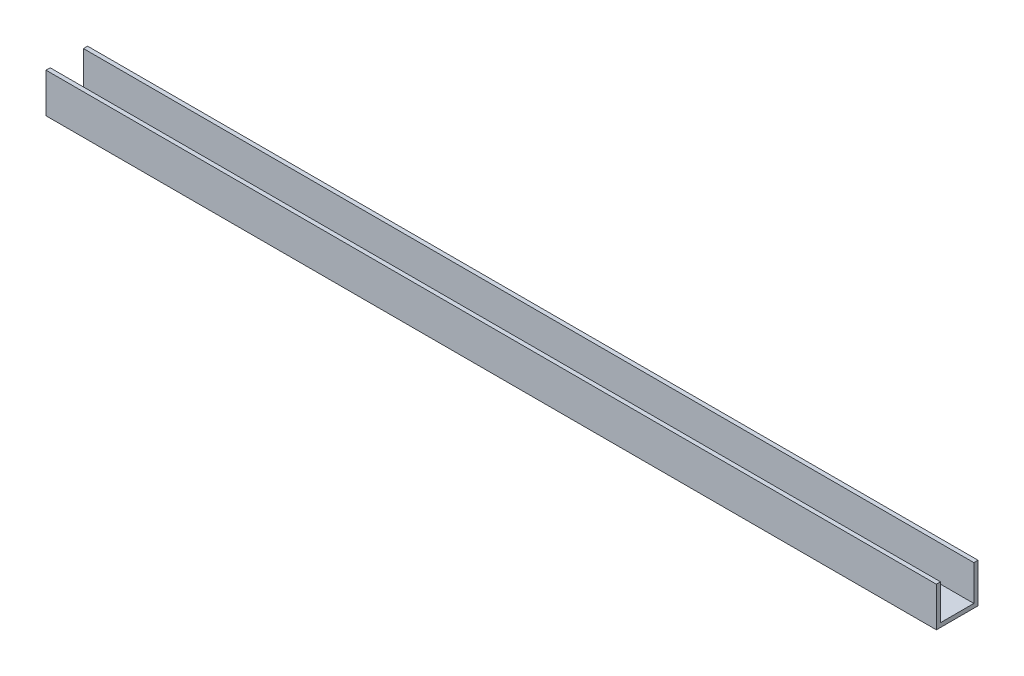
ISO-10303-21;
HEADER;
FILE_DESCRIPTION(('STEP AP214'),'2;1');
FILE_NAME('part.step','',(''),(''),'','','');
FILE_SCHEMA(('AUTOMOTIVE_DESIGN { 1 0 10303 214 1 1 1 1 }'));
ENDSEC;
DATA;
#1=APPLICATION_CONTEXT('core data for automotive mechanical design processes');
#2=APPLICATION_PROTOCOL_DEFINITION('international standard','automotive_design',2000,#1);
#3=PRODUCT_CONTEXT('',#1,'mechanical');
#4=PRODUCT('Part','Part','',(#3));
#5=PRODUCT_RELATED_PRODUCT_CATEGORY('part','',(#4));
#6=PRODUCT_DEFINITION_FORMATION('','',#4);
#7=PRODUCT_DEFINITION_CONTEXT('part definition',#1,'design');
#8=PRODUCT_DEFINITION('design','',#6,#7);
#9=PRODUCT_DEFINITION_SHAPE('','',#8);
#10=(LENGTH_UNIT() NAMED_UNIT(*) SI_UNIT(.MILLI.,.METRE.));
#11=(NAMED_UNIT(*) PLANE_ANGLE_UNIT() SI_UNIT($,.RADIAN.));
#12=(NAMED_UNIT(*) SI_UNIT($,.STERADIAN.) SOLID_ANGLE_UNIT());
#13=UNCERTAINTY_MEASURE_WITH_UNIT(LENGTH_MEASURE(1.E-05),#10,'distance_accuracy_value','');
#14=(GEOMETRIC_REPRESENTATION_CONTEXT(3) GLOBAL_UNCERTAINTY_ASSIGNED_CONTEXT((#13)) GLOBAL_UNIT_ASSIGNED_CONTEXT((#10,
#11,#12)) REPRESENTATION_CONTEXT('',''));
#15=CARTESIAN_POINT('',(0.,0.,0.));
#16=DIRECTION('',(0.,0.,1.));
#17=DIRECTION('',(1.,0.,0.));
#18=AXIS2_PLACEMENT_3D('',#15,#16,#17);
#19=CARTESIAN_POINT('',(107.,9.5,5.));
#20=DIRECTION('',(0.,0.,-1.));
#21=DIRECTION('',(0.,1.,0.));
#22=AXIS2_PLACEMENT_3D('',#19,#20,#21);
#23=PLANE('',#22);
#24=DIRECTION('',(0.,-1.,0.));
#25=VECTOR('',#24,1.);
#26=CARTESIAN_POINT('',(-107.,9.5,5.));
#27=LINE('',#26,#25);
#28=CARTESIAN_POINT('',(-107.,9.5,5.));
#29=VERTEX_POINT('',#28);
#30=CARTESIAN_POINT('',(-107.,0.,5.));
#31=VERTEX_POINT('',#30);
#32=EDGE_CURVE('E131',#29,#31,#27,.T.);
#33=ORIENTED_EDGE('',*,*,#32,.T.);
#34=DIRECTION('',(-1.,0.,0.));
#35=VECTOR('',#34,1.);
#36=CARTESIAN_POINT('',(107.,0.,5.));
#37=LINE('',#36,#35);
#38=CARTESIAN_POINT('',(107.,0.,5.));
#39=VERTEX_POINT('',#38);
#40=EDGE_CURVE('E11',#39,#31,#37,.T.);
#41=ORIENTED_EDGE('',*,*,#40,.F.);
#42=DIRECTION('',(0.,-1.,0.));
#43=VECTOR('',#42,1.);
#44=CARTESIAN_POINT('',(107.,9.5,5.));
#45=LINE('',#44,#43);
#46=CARTESIAN_POINT('',(107.,9.5,5.));
#47=VERTEX_POINT('',#46);
#48=EDGE_CURVE('E146',#47,#39,#45,.T.);
#49=ORIENTED_EDGE('',*,*,#48,.F.);
#50=DIRECTION('',(-1.,0.,0.));
#51=VECTOR('',#50,1.);
#52=CARTESIAN_POINT('',(107.,9.5,5.));
#53=LINE('',#52,#51);
#54=EDGE_CURVE('E127',#47,#29,#53,.T.);
#55=ORIENTED_EDGE('',*,*,#54,.T.);
#56=EDGE_LOOP('',(#33,#41,#49,#55));
#57=FACE_BOUND('',#56,.T.);
#58=ADVANCED_FACE('F33',(#57),#23,.F.);
#59=CARTESIAN_POINT('',(107.,0.,5.));
#60=DIRECTION('',(0.,1.,0.));
#61=DIRECTION('',(0.,0.,1.));
#62=AXIS2_PLACEMENT_3D('',#59,#60,#61);
#63=PLANE('',#62);
#64=CARTESIAN_POINT('',(90.,0.,0.));
#65=DIRECTION('',(0.,-1.,0.));
#66=DIRECTION('',(0.,0.,-1.));
#67=AXIS2_PLACEMENT_3D('',#64,#65,#66);
#68=CIRCLE('',#67,2.50000000000001);
#69=CARTESIAN_POINT('',(90.,0.,-2.50000000000001));
#70=VERTEX_POINT('',#69);
#71=EDGE_CURVE('E232',#70,#70,#68,.T.);
#72=ORIENTED_EDGE('',*,*,#71,.F.);
#73=EDGE_LOOP('',(#72));
#74=FACE_BOUND('',#73,.T.);
#75=CARTESIAN_POINT('',(81.,0.,0.));
#76=DIRECTION('',(0.,-1.,0.));
#77=DIRECTION('',(0.,0.,-1.));
#78=AXIS2_PLACEMENT_3D('',#75,#76,#77);
#79=CIRCLE('',#78,2.49999999999999);
#80=CARTESIAN_POINT('',(81.,0.,-2.49999999999999));
#81=VERTEX_POINT('',#80);
#82=EDGE_CURVE('E222',#81,#81,#79,.T.);
#83=ORIENTED_EDGE('',*,*,#82,.F.);
#84=EDGE_LOOP('',(#83));
#85=FACE_BOUND('',#84,.T.);
#86=CARTESIAN_POINT('',(72.,0.,0.));
#87=DIRECTION('',(0.,-1.,0.));
#88=DIRECTION('',(0.,0.,-1.));
#89=AXIS2_PLACEMENT_3D('',#86,#87,#88);
#90=CIRCLE('',#89,2.5);
#91=CARTESIAN_POINT('',(72.,0.,-2.5));
#92=VERTEX_POINT('',#91);
#93=EDGE_CURVE('E219',#92,#92,#90,.T.);
#94=ORIENTED_EDGE('',*,*,#93,.F.);
#95=EDGE_LOOP('',(#94));
#96=FACE_BOUND('',#95,.T.);
#97=CARTESIAN_POINT('',(58.,0.,0.));
#98=DIRECTION('',(0.,-1.,0.));
#99=DIRECTION('',(0.,0.,-1.));
#100=AXIS2_PLACEMENT_3D('',#97,#98,#99);
#101=CIRCLE('',#100,2.50000000000001);
#102=CARTESIAN_POINT('',(58.,0.,-2.50000000000001));
#103=VERTEX_POINT('',#102);
#104=EDGE_CURVE('E216',#103,#103,#101,.T.);
#105=ORIENTED_EDGE('',*,*,#104,.F.);
#106=EDGE_LOOP('',(#105));
#107=FACE_BOUND('',#106,.T.);
#108=CARTESIAN_POINT('',(49.,0.,0.));
#109=DIRECTION('',(0.,-1.,0.));
#110=DIRECTION('',(0.,0.,-1.));
#111=AXIS2_PLACEMENT_3D('',#108,#109,#110);
#112=CIRCLE('',#111,2.49999999999999);
#113=CARTESIAN_POINT('',(49.,0.,-2.49999999999999));
#114=VERTEX_POINT('',#113);
#115=EDGE_CURVE('E212',#114,#114,#112,.T.);
#116=ORIENTED_EDGE('',*,*,#115,.F.);
#117=EDGE_LOOP('',(#116));
#118=FACE_BOUND('',#117,.T.);
#119=CARTESIAN_POINT('',(40.,0.,0.));
#120=DIRECTION('',(0.,-1.,0.));
#121=DIRECTION('',(0.,0.,-1.));
#122=AXIS2_PLACEMENT_3D('',#119,#120,#121);
#123=CIRCLE('',#122,2.49999999999999);
#124=CARTESIAN_POINT('',(40.,0.,-2.49999999999999));
#125=VERTEX_POINT('',#124);
#126=EDGE_CURVE('E208',#125,#125,#123,.T.);
#127=ORIENTED_EDGE('',*,*,#126,.F.);
#128=EDGE_LOOP('',(#127));
#129=FACE_BOUND('',#128,.T.);
#130=CARTESIAN_POINT('',(26.,0.,0.));
#131=DIRECTION('',(0.,-1.,0.));
#132=DIRECTION('',(0.,0.,-1.));
#133=AXIS2_PLACEMENT_3D('',#130,#131,#132);
#134=CIRCLE('',#133,2.50000000000001);
#135=CARTESIAN_POINT('',(26.,0.,-2.50000000000001));
#136=VERTEX_POINT('',#135);
#137=EDGE_CURVE('E204',#136,#136,#134,.T.);
#138=ORIENTED_EDGE('',*,*,#137,.F.);
#139=EDGE_LOOP('',(#138));
#140=FACE_BOUND('',#139,.T.);
#141=CARTESIAN_POINT('',(17.,0.,0.));
#142=DIRECTION('',(0.,-1.,0.));
#143=DIRECTION('',(0.,0.,-1.));
#144=AXIS2_PLACEMENT_3D('',#141,#142,#143);
#145=CIRCLE('',#144,2.49999999999999);
#146=CARTESIAN_POINT('',(17.,0.,-2.49999999999999));
#147=VERTEX_POINT('',#146);
#148=EDGE_CURVE('E200',#147,#147,#145,.T.);
#149=ORIENTED_EDGE('',*,*,#148,.F.);
#150=EDGE_LOOP('',(#149));
#151=FACE_BOUND('',#150,.T.);
#152=CARTESIAN_POINT('',(8.00000000000001,0.,0.));
#153=DIRECTION('',(0.,-1.,0.));
#154=DIRECTION('',(0.,0.,-1.));
#155=AXIS2_PLACEMENT_3D('',#152,#153,#154);
#156=CIRCLE('',#155,2.49999999999999);
#157=CARTESIAN_POINT('',(8.00000000000001,0.,-2.49999999999999));
#158=VERTEX_POINT('',#157);
#159=EDGE_CURVE('E196',#158,#158,#156,.T.);
#160=ORIENTED_EDGE('',*,*,#159,.F.);
#161=EDGE_LOOP('',(#160));
#162=FACE_BOUND('',#161,.T.);
#163=CARTESIAN_POINT('',(-5.99999999999999,0.,0.));
#164=DIRECTION('',(0.,-1.,0.));
#165=DIRECTION('',(0.,0.,-1.));
#166=AXIS2_PLACEMENT_3D('',#163,#164,#165);
#167=CIRCLE('',#166,2.50000000000001);
#168=CARTESIAN_POINT('',(-5.99999999999999,0.,-2.50000000000001));
#169=VERTEX_POINT('',#168);
#170=EDGE_CURVE('E192',#169,#169,#167,.T.);
#171=ORIENTED_EDGE('',*,*,#170,.F.);
#172=EDGE_LOOP('',(#171));
#173=FACE_BOUND('',#172,.T.);
#174=CARTESIAN_POINT('',(-15.,0.,0.));
#175=DIRECTION('',(0.,-1.,0.));
#176=DIRECTION('',(0.,0.,-1.));
#177=AXIS2_PLACEMENT_3D('',#174,#175,#176);
#178=CIRCLE('',#177,2.49999999999999);
#179=CARTESIAN_POINT('',(-15.,0.,-2.49999999999999));
#180=VERTEX_POINT('',#179);
#181=EDGE_CURVE('E188',#180,#180,#178,.T.);
#182=ORIENTED_EDGE('',*,*,#181,.F.);
#183=EDGE_LOOP('',(#182));
#184=FACE_BOUND('',#183,.T.);
#185=CARTESIAN_POINT('',(-24.,0.,0.));
#186=DIRECTION('',(0.,-1.,0.));
#187=DIRECTION('',(0.,0.,-1.));
#188=AXIS2_PLACEMENT_3D('',#185,#186,#187);
#189=CIRCLE('',#188,2.49999999999999);
#190=CARTESIAN_POINT('',(-24.,0.,-2.49999999999999));
#191=VERTEX_POINT('',#190);
#192=EDGE_CURVE('E184',#191,#191,#189,.T.);
#193=ORIENTED_EDGE('',*,*,#192,.F.);
#194=EDGE_LOOP('',(#193));
#195=FACE_BOUND('',#194,.T.);
#196=CARTESIAN_POINT('',(-38.,0.,0.));
#197=DIRECTION('',(0.,-1.,0.));
#198=DIRECTION('',(0.,0.,-1.));
#199=AXIS2_PLACEMENT_3D('',#196,#197,#198);
#200=CIRCLE('',#199,2.50000000000001);
#201=CARTESIAN_POINT('',(-38.,0.,-2.50000000000001));
#202=VERTEX_POINT('',#201);
#203=EDGE_CURVE('E180',#202,#202,#200,.T.);
#204=ORIENTED_EDGE('',*,*,#203,.F.);
#205=EDGE_LOOP('',(#204));
#206=FACE_BOUND('',#205,.T.);
#207=CARTESIAN_POINT('',(-47.,0.,0.));
#208=DIRECTION('',(0.,-1.,0.));
#209=DIRECTION('',(0.,0.,-1.));
#210=AXIS2_PLACEMENT_3D('',#207,#208,#209);
#211=CIRCLE('',#210,2.49999999999999);
#212=CARTESIAN_POINT('',(-47.,0.,-2.49999999999999));
#213=VERTEX_POINT('',#212);
#214=EDGE_CURVE('E176',#213,#213,#211,.T.);
#215=ORIENTED_EDGE('',*,*,#214,.F.);
#216=EDGE_LOOP('',(#215));
#217=FACE_BOUND('',#216,.T.);
#218=CARTESIAN_POINT('',(-56.,0.,0.));
#219=DIRECTION('',(0.,-1.,0.));
#220=DIRECTION('',(0.,0.,-1.));
#221=AXIS2_PLACEMENT_3D('',#218,#219,#220);
#222=CIRCLE('',#221,2.49999999999999);
#223=CARTESIAN_POINT('',(-56.,0.,-2.49999999999999));
#224=VERTEX_POINT('',#223);
#225=EDGE_CURVE('E172',#224,#224,#222,.T.);
#226=ORIENTED_EDGE('',*,*,#225,.F.);
#227=EDGE_LOOP('',(#226));
#228=FACE_BOUND('',#227,.T.);
#229=CARTESIAN_POINT('',(-70.,0.,0.));
#230=DIRECTION('',(0.,-1.,0.));
#231=DIRECTION('',(0.,0.,-1.));
#232=AXIS2_PLACEMENT_3D('',#229,#230,#231);
#233=CIRCLE('',#232,2.50000000000001);
#234=CARTESIAN_POINT('',(-70.,0.,-2.50000000000001));
#235=VERTEX_POINT('',#234);
#236=EDGE_CURVE('E168',#235,#235,#233,.T.);
#237=ORIENTED_EDGE('',*,*,#236,.F.);
#238=EDGE_LOOP('',(#237));
#239=FACE_BOUND('',#238,.T.);
#240=CARTESIAN_POINT('',(-79.,0.,0.));
#241=DIRECTION('',(0.,-1.,0.));
#242=DIRECTION('',(0.,0.,-1.));
#243=AXIS2_PLACEMENT_3D('',#240,#241,#242);
#244=CIRCLE('',#243,2.5);
#245=CARTESIAN_POINT('',(-79.,0.,-2.5));
#246=VERTEX_POINT('',#245);
#247=EDGE_CURVE('E164',#246,#246,#244,.T.);
#248=ORIENTED_EDGE('',*,*,#247,.F.);
#249=EDGE_LOOP('',(#248));
#250=FACE_BOUND('',#249,.T.);
#251=CARTESIAN_POINT('',(-88.,0.,0.));
#252=DIRECTION('',(0.,-1.,0.));
#253=DIRECTION('',(0.,0.,-1.));
#254=AXIS2_PLACEMENT_3D('',#251,#252,#253);
#255=CIRCLE('',#254,2.5);
#256=CARTESIAN_POINT('',(-88.,0.,-2.5));
#257=VERTEX_POINT('',#256);
#258=EDGE_CURVE('E160',#257,#257,#255,.T.);
#259=ORIENTED_EDGE('',*,*,#258,.F.);
#260=EDGE_LOOP('',(#259));
#261=FACE_BOUND('',#260,.T.);
#262=DIRECTION('',(0.,0.,-1.));
#263=VECTOR('',#262,1.);
#264=CARTESIAN_POINT('',(-107.,0.,5.));
#265=LINE('',#264,#263);
#266=CARTESIAN_POINT('',(-107.,0.,-5.));
#267=VERTEX_POINT('',#266);
#268=EDGE_CURVE('E134',#31,#267,#265,.T.);
#269=ORIENTED_EDGE('',*,*,#268,.T.);
#270=DIRECTION('',(-1.,0.,0.));
#271=VECTOR('',#270,1.);
#272=CARTESIAN_POINT('',(107.,0.,-5.));
#273=LINE('',#272,#271);
#274=CARTESIAN_POINT('',(107.,0.,-5.));
#275=VERTEX_POINT('',#274);
#276=EDGE_CURVE('E42',#275,#267,#273,.T.);
#277=ORIENTED_EDGE('',*,*,#276,.F.);
#278=DIRECTION('',(0.,0.,-1.));
#279=VECTOR('',#278,1.);
#280=CARTESIAN_POINT('',(107.,0.,5.));
#281=LINE('',#280,#279);
#282=EDGE_CURVE('E94',#39,#275,#281,.T.);
#283=ORIENTED_EDGE('',*,*,#282,.F.);
#284=ORIENTED_EDGE('',*,*,#40,.T.);
#285=EDGE_LOOP('',(#269,#277,#283,#284));
#286=FACE_BOUND('',#285,.T.);
#287=ADVANCED_FACE('F298',(#74,#85,#96,#107,#118,#129,#140,#151,#162,#173,#184,#195,#206,#217,
#228,#239,#250,#261,#286),#63,.F.);
#288=CARTESIAN_POINT('',(107.,9.5,-5.));
#289=DIRECTION('',(0.,0.,1.));
#290=DIRECTION('',(0.,-1.,0.));
#291=AXIS2_PLACEMENT_3D('',#288,#289,#290);
#292=PLANE('',#291);
#293=DIRECTION('',(0.,1.,0.));
#294=VECTOR('',#293,1.);
#295=CARTESIAN_POINT('',(-107.,9.5,-5.));
#296=LINE('',#295,#294);
#297=CARTESIAN_POINT('',(-107.,9.5,-5.));
#298=VERTEX_POINT('',#297);
#299=EDGE_CURVE('E137',#267,#298,#296,.T.);
#300=ORIENTED_EDGE('',*,*,#299,.T.);
#301=DIRECTION('',(-1.,0.,0.));
#302=VECTOR('',#301,1.);
#303=CARTESIAN_POINT('',(107.,9.5,-5.));
#304=LINE('',#303,#302);
#305=CARTESIAN_POINT('',(107.,9.5,-5.));
#306=VERTEX_POINT('',#305);
#307=EDGE_CURVE('E153',#306,#298,#304,.T.);
#308=ORIENTED_EDGE('',*,*,#307,.F.);
#309=DIRECTION('',(0.,1.,0.));
#310=VECTOR('',#309,1.);
#311=CARTESIAN_POINT('',(107.,9.5,-5.));
#312=LINE('',#311,#310);
#313=EDGE_CURVE('E267',#275,#306,#312,.T.);
#314=ORIENTED_EDGE('',*,*,#313,.F.);
#315=ORIENTED_EDGE('',*,*,#276,.T.);
#316=EDGE_LOOP('',(#300,#308,#314,#315));
#317=FACE_BOUND('',#316,.T.);
#318=ADVANCED_FACE('F302',(#317),#292,.F.);
#319=CARTESIAN_POINT('',(107.,9.5,-5.));
#320=DIRECTION('',(0.,-1.,0.));
#321=DIRECTION('',(0.,0.,-1.));
#322=AXIS2_PLACEMENT_3D('',#319,#320,#321);
#323=PLANE('',#322);
#324=DIRECTION('',(0.,0.,1.));
#325=VECTOR('',#324,1.);
#326=CARTESIAN_POINT('',(-107.,9.5,-5.));
#327=LINE('',#326,#325);
#328=CARTESIAN_POINT('',(-107.,9.5,-4.));
#329=VERTEX_POINT('',#328);
#330=EDGE_CURVE('E139',#298,#329,#327,.T.);
#331=ORIENTED_EDGE('',*,*,#330,.T.);
#332=DIRECTION('',(-1.,0.,0.));
#333=VECTOR('',#332,1.);
#334=CARTESIAN_POINT('',(107.,9.5,-4.));
#335=LINE('',#334,#333);
#336=CARTESIAN_POINT('',(107.,9.5,-4.));
#337=VERTEX_POINT('',#336);
#338=EDGE_CURVE('E150',#337,#329,#335,.T.);
#339=ORIENTED_EDGE('',*,*,#338,.F.);
#340=DIRECTION('',(0.,0.,1.));
#341=VECTOR('',#340,1.);
#342=CARTESIAN_POINT('',(107.,9.5,-5.));
#343=LINE('',#342,#341);
#344=EDGE_CURVE('E269',#306,#337,#343,.T.);
#345=ORIENTED_EDGE('',*,*,#344,.F.);
#346=ORIENTED_EDGE('',*,*,#307,.T.);
#347=EDGE_LOOP('',(#331,#339,#345,#346));
#348=FACE_BOUND('',#347,.T.);
#349=ADVANCED_FACE('F275',(#348),#323,.F.);
#350=CARTESIAN_POINT('',(107.,9.5,-4.));
#351=DIRECTION('',(0.,0.,-1.));
#352=DIRECTION('',(-1.,0.,0.));
#353=AXIS2_PLACEMENT_3D('',#350,#351,#352);
#354=PLANE('',#353);
#355=DIRECTION('',(0.,-1.,0.));
#356=VECTOR('',#355,1.);
#357=CARTESIAN_POINT('',(-107.,9.5,-4.));
#358=LINE('',#357,#356);
#359=CARTESIAN_POINT('',(-107.,1.,-4.));
#360=VERTEX_POINT('',#359);
#361=EDGE_CURVE('E141',#329,#360,#358,.T.);
#362=ORIENTED_EDGE('',*,*,#361,.T.);
#363=DIRECTION('',(-1.,0.,0.));
#364=VECTOR('',#363,1.);
#365=CARTESIAN_POINT('',(107.,1.,-4.));
#366=LINE('',#365,#364);
#367=CARTESIAN_POINT('',(107.,1.,-4.));
#368=VERTEX_POINT('',#367);
#369=EDGE_CURVE('E122',#368,#360,#366,.T.);
#370=ORIENTED_EDGE('',*,*,#369,.F.);
#371=DIRECTION('',(0.,-1.,0.));
#372=VECTOR('',#371,1.);
#373=CARTESIAN_POINT('',(107.,9.5,-4.));
#374=LINE('',#373,#372);
#375=EDGE_CURVE('E113',#337,#368,#374,.T.);
#376=ORIENTED_EDGE('',*,*,#375,.F.);
#377=ORIENTED_EDGE('',*,*,#338,.T.);
#378=EDGE_LOOP('',(#362,#370,#376,#377));
#379=FACE_BOUND('',#378,.T.);
#380=ADVANCED_FACE('F279',(#379),#354,.F.);
#381=CARTESIAN_POINT('',(107.,1.,4.));
#382=DIRECTION('',(0.,-1.,0.));
#383=DIRECTION('',(0.,0.,-1.));
#384=AXIS2_PLACEMENT_3D('',#381,#382,#383);
#385=PLANE('',#384);
#386=CARTESIAN_POINT('',(90.,1.,0.));
#387=DIRECTION('',(0.,-1.,0.));
#388=DIRECTION('',(0.,0.,-1.));
#389=AXIS2_PLACEMENT_3D('',#386,#387,#388);
#390=CIRCLE('',#389,2.50000000000001);
#391=CARTESIAN_POINT('',(90.,1.,-2.50000000000001));
#392=VERTEX_POINT('',#391);
#393=EDGE_CURVE('E36',#392,#392,#390,.T.);
#394=ORIENTED_EDGE('',*,*,#393,.T.);
#395=EDGE_LOOP('',(#394));
#396=FACE_BOUND('',#395,.T.);
#397=CARTESIAN_POINT('',(81.,1.,0.));
#398=DIRECTION('',(0.,-1.,0.));
#399=DIRECTION('',(0.,0.,-1.));
#400=AXIS2_PLACEMENT_3D('',#397,#398,#399);
#401=CIRCLE('',#400,2.49999999999999);
#402=CARTESIAN_POINT('',(81.,1.,-2.49999999999999));
#403=VERTEX_POINT('',#402);
#404=EDGE_CURVE('E220',#403,#403,#401,.T.);
#405=ORIENTED_EDGE('',*,*,#404,.T.);
#406=EDGE_LOOP('',(#405));
#407=FACE_BOUND('',#406,.T.);
#408=CARTESIAN_POINT('',(72.,1.,0.));
#409=DIRECTION('',(0.,-1.,0.));
#410=DIRECTION('',(0.,0.,-1.));
#411=AXIS2_PLACEMENT_3D('',#408,#409,#410);
#412=CIRCLE('',#411,2.5);
#413=CARTESIAN_POINT('',(72.,1.,-2.5));
#414=VERTEX_POINT('',#413);
#415=EDGE_CURVE('E217',#414,#414,#412,.T.);
#416=ORIENTED_EDGE('',*,*,#415,.T.);
#417=EDGE_LOOP('',(#416));
#418=FACE_BOUND('',#417,.T.);
#419=CARTESIAN_POINT('',(58.,1.,0.));
#420=DIRECTION('',(0.,-1.,0.));
#421=DIRECTION('',(0.,0.,-1.));
#422=AXIS2_PLACEMENT_3D('',#419,#420,#421);
#423=CIRCLE('',#422,2.50000000000001);
#424=CARTESIAN_POINT('',(58.,1.,-2.50000000000001));
#425=VERTEX_POINT('',#424);
#426=EDGE_CURVE('E213',#425,#425,#423,.T.);
#427=ORIENTED_EDGE('',*,*,#426,.T.);
#428=EDGE_LOOP('',(#427));
#429=FACE_BOUND('',#428,.T.);
#430=CARTESIAN_POINT('',(49.,1.,0.));
#431=DIRECTION('',(0.,-1.,0.));
#432=DIRECTION('',(0.,0.,-1.));
#433=AXIS2_PLACEMENT_3D('',#430,#431,#432);
#434=CIRCLE('',#433,2.49999999999999);
#435=CARTESIAN_POINT('',(49.,1.,-2.49999999999999));
#436=VERTEX_POINT('',#435);
#437=EDGE_CURVE('E209',#436,#436,#434,.T.);
#438=ORIENTED_EDGE('',*,*,#437,.T.);
#439=EDGE_LOOP('',(#438));
#440=FACE_BOUND('',#439,.T.);
#441=CARTESIAN_POINT('',(40.,1.,0.));
#442=DIRECTION('',(0.,-1.,0.));
#443=DIRECTION('',(0.,0.,-1.));
#444=AXIS2_PLACEMENT_3D('',#441,#442,#443);
#445=CIRCLE('',#444,2.49999999999999);
#446=CARTESIAN_POINT('',(40.,1.,-2.49999999999999));
#447=VERTEX_POINT('',#446);
#448=EDGE_CURVE('E205',#447,#447,#445,.T.);
#449=ORIENTED_EDGE('',*,*,#448,.T.);
#450=EDGE_LOOP('',(#449));
#451=FACE_BOUND('',#450,.T.);
#452=CARTESIAN_POINT('',(26.,1.,0.));
#453=DIRECTION('',(0.,-1.,0.));
#454=DIRECTION('',(0.,0.,-1.));
#455=AXIS2_PLACEMENT_3D('',#452,#453,#454);
#456=CIRCLE('',#455,2.50000000000001);
#457=CARTESIAN_POINT('',(26.,1.,-2.50000000000001));
#458=VERTEX_POINT('',#457);
#459=EDGE_CURVE('E201',#458,#458,#456,.T.);
#460=ORIENTED_EDGE('',*,*,#459,.T.);
#461=EDGE_LOOP('',(#460));
#462=FACE_BOUND('',#461,.T.);
#463=CARTESIAN_POINT('',(17.,1.,0.));
#464=DIRECTION('',(0.,-1.,0.));
#465=DIRECTION('',(0.,0.,-1.));
#466=AXIS2_PLACEMENT_3D('',#463,#464,#465);
#467=CIRCLE('',#466,2.49999999999999);
#468=CARTESIAN_POINT('',(17.,1.,-2.49999999999999));
#469=VERTEX_POINT('',#468);
#470=EDGE_CURVE('E197',#469,#469,#467,.T.);
#471=ORIENTED_EDGE('',*,*,#470,.T.);
#472=EDGE_LOOP('',(#471));
#473=FACE_BOUND('',#472,.T.);
#474=CARTESIAN_POINT('',(8.00000000000001,1.,0.));
#475=DIRECTION('',(0.,-1.,0.));
#476=DIRECTION('',(0.,0.,-1.));
#477=AXIS2_PLACEMENT_3D('',#474,#475,#476);
#478=CIRCLE('',#477,2.49999999999999);
#479=CARTESIAN_POINT('',(8.00000000000001,1.,-2.49999999999999));
#480=VERTEX_POINT('',#479);
#481=EDGE_CURVE('E193',#480,#480,#478,.T.);
#482=ORIENTED_EDGE('',*,*,#481,.T.);
#483=EDGE_LOOP('',(#482));
#484=FACE_BOUND('',#483,.T.);
#485=CARTESIAN_POINT('',(-5.99999999999999,1.,0.));
#486=DIRECTION('',(0.,-1.,0.));
#487=DIRECTION('',(0.,0.,-1.));
#488=AXIS2_PLACEMENT_3D('',#485,#486,#487);
#489=CIRCLE('',#488,2.50000000000001);
#490=CARTESIAN_POINT('',(-5.99999999999999,1.,-2.50000000000001));
#491=VERTEX_POINT('',#490);
#492=EDGE_CURVE('E189',#491,#491,#489,.T.);
#493=ORIENTED_EDGE('',*,*,#492,.T.);
#494=EDGE_LOOP('',(#493));
#495=FACE_BOUND('',#494,.T.);
#496=CARTESIAN_POINT('',(-15.,1.,0.));
#497=DIRECTION('',(0.,-1.,0.));
#498=DIRECTION('',(0.,0.,-1.));
#499=AXIS2_PLACEMENT_3D('',#496,#497,#498);
#500=CIRCLE('',#499,2.49999999999999);
#501=CARTESIAN_POINT('',(-15.,1.,-2.49999999999999));
#502=VERTEX_POINT('',#501);
#503=EDGE_CURVE('E185',#502,#502,#500,.T.);
#504=ORIENTED_EDGE('',*,*,#503,.T.);
#505=EDGE_LOOP('',(#504));
#506=FACE_BOUND('',#505,.T.);
#507=CARTESIAN_POINT('',(-24.,1.,0.));
#508=DIRECTION('',(0.,-1.,0.));
#509=DIRECTION('',(0.,0.,-1.));
#510=AXIS2_PLACEMENT_3D('',#507,#508,#509);
#511=CIRCLE('',#510,2.49999999999999);
#512=CARTESIAN_POINT('',(-24.,1.,-2.49999999999999));
#513=VERTEX_POINT('',#512);
#514=EDGE_CURVE('E181',#513,#513,#511,.T.);
#515=ORIENTED_EDGE('',*,*,#514,.T.);
#516=EDGE_LOOP('',(#515));
#517=FACE_BOUND('',#516,.T.);
#518=CARTESIAN_POINT('',(-38.,1.,0.));
#519=DIRECTION('',(0.,-1.,0.));
#520=DIRECTION('',(0.,0.,-1.));
#521=AXIS2_PLACEMENT_3D('',#518,#519,#520);
#522=CIRCLE('',#521,2.50000000000001);
#523=CARTESIAN_POINT('',(-38.,1.,-2.50000000000001));
#524=VERTEX_POINT('',#523);
#525=EDGE_CURVE('E177',#524,#524,#522,.T.);
#526=ORIENTED_EDGE('',*,*,#525,.T.);
#527=EDGE_LOOP('',(#526));
#528=FACE_BOUND('',#527,.T.);
#529=CARTESIAN_POINT('',(-47.,1.,0.));
#530=DIRECTION('',(0.,-1.,0.));
#531=DIRECTION('',(0.,0.,-1.));
#532=AXIS2_PLACEMENT_3D('',#529,#530,#531);
#533=CIRCLE('',#532,2.49999999999999);
#534=CARTESIAN_POINT('',(-47.,1.,-2.49999999999999));
#535=VERTEX_POINT('',#534);
#536=EDGE_CURVE('E173',#535,#535,#533,.T.);
#537=ORIENTED_EDGE('',*,*,#536,.T.);
#538=EDGE_LOOP('',(#537));
#539=FACE_BOUND('',#538,.T.);
#540=CARTESIAN_POINT('',(-56.,1.,0.));
#541=DIRECTION('',(0.,-1.,0.));
#542=DIRECTION('',(0.,0.,-1.));
#543=AXIS2_PLACEMENT_3D('',#540,#541,#542);
#544=CIRCLE('',#543,2.49999999999999);
#545=CARTESIAN_POINT('',(-56.,1.,-2.49999999999999));
#546=VERTEX_POINT('',#545);
#547=EDGE_CURVE('E169',#546,#546,#544,.T.);
#548=ORIENTED_EDGE('',*,*,#547,.T.);
#549=EDGE_LOOP('',(#548));
#550=FACE_BOUND('',#549,.T.);
#551=CARTESIAN_POINT('',(-70.,1.,0.));
#552=DIRECTION('',(0.,-1.,0.));
#553=DIRECTION('',(0.,0.,-1.));
#554=AXIS2_PLACEMENT_3D('',#551,#552,#553);
#555=CIRCLE('',#554,2.50000000000001);
#556=CARTESIAN_POINT('',(-70.,1.,-2.50000000000001));
#557=VERTEX_POINT('',#556);
#558=EDGE_CURVE('E165',#557,#557,#555,.T.);
#559=ORIENTED_EDGE('',*,*,#558,.T.);
#560=EDGE_LOOP('',(#559));
#561=FACE_BOUND('',#560,.T.);
#562=CARTESIAN_POINT('',(-79.,1.,0.));
#563=DIRECTION('',(0.,-1.,0.));
#564=DIRECTION('',(0.,0.,-1.));
#565=AXIS2_PLACEMENT_3D('',#562,#563,#564);
#566=CIRCLE('',#565,2.5);
#567=CARTESIAN_POINT('',(-79.,1.,-2.5));
#568=VERTEX_POINT('',#567);
#569=EDGE_CURVE('E161',#568,#568,#566,.T.);
#570=ORIENTED_EDGE('',*,*,#569,.T.);
#571=EDGE_LOOP('',(#570));
#572=FACE_BOUND('',#571,.T.);
#573=CARTESIAN_POINT('',(-88.,1.,0.));
#574=DIRECTION('',(0.,-1.,0.));
#575=DIRECTION('',(0.,0.,-1.));
#576=AXIS2_PLACEMENT_3D('',#573,#574,#575);
#577=CIRCLE('',#576,2.5);
#578=CARTESIAN_POINT('',(-88.,1.,-2.5));
#579=VERTEX_POINT('',#578);
#580=EDGE_CURVE('E135',#579,#579,#577,.T.);
#581=ORIENTED_EDGE('',*,*,#580,.T.);
#582=EDGE_LOOP('',(#581));
#583=FACE_BOUND('',#582,.T.);
#584=DIRECTION('',(0.,0.,1.));
#585=VECTOR('',#584,1.);
#586=CARTESIAN_POINT('',(-107.,1.,4.));
#587=LINE('',#586,#585);
#588=CARTESIAN_POINT('',(-107.,1.,4.));
#589=VERTEX_POINT('',#588);
#590=EDGE_CURVE('E121',#360,#589,#587,.T.);
#591=ORIENTED_EDGE('',*,*,#590,.T.);
#592=DIRECTION('',(-1.,0.,0.));
#593=VECTOR('',#592,1.);
#594=CARTESIAN_POINT('',(107.,1.,4.));
#595=LINE('',#594,#593);
#596=CARTESIAN_POINT('',(107.,1.,4.));
#597=VERTEX_POINT('',#596);
#598=EDGE_CURVE('E118',#597,#589,#595,.T.);
#599=ORIENTED_EDGE('',*,*,#598,.F.);
#600=DIRECTION('',(0.,0.,1.));
#601=VECTOR('',#600,1.);
#602=CARTESIAN_POINT('',(107.,1.,4.));
#603=LINE('',#602,#601);
#604=EDGE_CURVE('E107',#368,#597,#603,.T.);
#605=ORIENTED_EDGE('',*,*,#604,.F.);
#606=ORIENTED_EDGE('',*,*,#369,.T.);
#607=EDGE_LOOP('',(#591,#599,#605,#606));
#608=FACE_BOUND('',#607,.T.);
#609=ADVANCED_FACE('F119',(#396,#407,#418,#429,#440,#451,#462,#473,#484,#495,#506,#517,#528,
#539,#550,#561,#572,#583,#608),#385,.F.);
#610=CARTESIAN_POINT('',(107.,9.5,4.));
#611=DIRECTION('',(0.,0.,1.));
#612=DIRECTION('',(1.,0.,0.));
#613=AXIS2_PLACEMENT_3D('',#610,#611,#612);
#614=PLANE('',#613);
#615=DIRECTION('',(0.,1.,0.));
#616=VECTOR('',#615,1.);
#617=CARTESIAN_POINT('',(-107.,9.5,4.));
#618=LINE('',#617,#616);
#619=CARTESIAN_POINT('',(-107.,9.5,4.));
#620=VERTEX_POINT('',#619);
#621=EDGE_CURVE('E80',#589,#620,#618,.T.);
#622=ORIENTED_EDGE('',*,*,#621,.T.);
#623=DIRECTION('',(-1.,0.,0.));
#624=VECTOR('',#623,1.);
#625=CARTESIAN_POINT('',(107.,9.5,4.));
#626=LINE('',#625,#624);
#627=CARTESIAN_POINT('',(107.,9.5,4.));
#628=VERTEX_POINT('',#627);
#629=EDGE_CURVE('E123',#628,#620,#626,.T.);
#630=ORIENTED_EDGE('',*,*,#629,.F.);
#631=DIRECTION('',(0.,1.,0.));
#632=VECTOR('',#631,1.);
#633=CARTESIAN_POINT('',(107.,9.5,4.));
#634=LINE('',#633,#632);
#635=EDGE_CURVE('E111',#597,#628,#634,.T.);
#636=ORIENTED_EDGE('',*,*,#635,.F.);
#637=ORIENTED_EDGE('',*,*,#598,.T.);
#638=EDGE_LOOP('',(#622,#630,#636,#637));
#639=FACE_BOUND('',#638,.T.);
#640=ADVANCED_FACE('F125',(#639),#614,.F.);
#641=CARTESIAN_POINT('',(107.,9.5,5.));
#642=DIRECTION('',(0.,-1.,0.));
#643=DIRECTION('',(0.,0.,-1.));
#644=AXIS2_PLACEMENT_3D('',#641,#642,#643);
#645=PLANE('',#644);
#646=DIRECTION('',(0.,0.,1.));
#647=VECTOR('',#646,1.);
#648=CARTESIAN_POINT('',(-107.,9.5,5.));
#649=LINE('',#648,#647);
#650=EDGE_CURVE('E86',#620,#29,#649,.T.);
#651=ORIENTED_EDGE('',*,*,#650,.T.);
#652=ORIENTED_EDGE('',*,*,#54,.F.);
#653=DIRECTION('',(0.,0.,1.));
#654=VECTOR('',#653,1.);
#655=CARTESIAN_POINT('',(107.,9.5,5.));
#656=LINE('',#655,#654);
#657=EDGE_CURVE('E51',#628,#47,#656,.T.);
#658=ORIENTED_EDGE('',*,*,#657,.F.);
#659=ORIENTED_EDGE('',*,*,#629,.T.);
#660=EDGE_LOOP('',(#651,#652,#658,#659));
#661=FACE_BOUND('',#660,.T.);
#662=ADVANCED_FACE('F287',(#661),#645,.F.);
#663=CARTESIAN_POINT('',(107.,0.,0.));
#664=DIRECTION('',(1.,0.,0.));
#665=DIRECTION('',(0.,0.,-1.));
#666=AXIS2_PLACEMENT_3D('',#663,#664,#665);
#667=PLANE('',#666);
#668=ORIENTED_EDGE('',*,*,#48,.T.);
#669=ORIENTED_EDGE('',*,*,#282,.T.);
#670=ORIENTED_EDGE('',*,*,#313,.T.);
#671=ORIENTED_EDGE('',*,*,#344,.T.);
#672=ORIENTED_EDGE('',*,*,#375,.T.);
#673=ORIENTED_EDGE('',*,*,#604,.T.);
#674=ORIENTED_EDGE('',*,*,#635,.T.);
#675=ORIENTED_EDGE('',*,*,#657,.T.);
#676=EDGE_LOOP('',(#668,#669,#670,#671,#672,#673,#674,#675));
#677=FACE_BOUND('',#676,.T.);
#678=ADVANCED_FACE('F109',(#677),#667,.T.);
#679=CARTESIAN_POINT('',(-107.,0.,0.));
#680=DIRECTION('',(1.,0.,0.));
#681=DIRECTION('',(0.,0.,-1.));
#682=AXIS2_PLACEMENT_3D('',#679,#680,#681);
#683=PLANE('',#682);
#684=ORIENTED_EDGE('',*,*,#32,.F.);
#685=ORIENTED_EDGE('',*,*,#650,.F.);
#686=ORIENTED_EDGE('',*,*,#621,.F.);
#687=ORIENTED_EDGE('',*,*,#590,.F.);
#688=ORIENTED_EDGE('',*,*,#361,.F.);
#689=ORIENTED_EDGE('',*,*,#330,.F.);
#690=ORIENTED_EDGE('',*,*,#299,.F.);
#691=ORIENTED_EDGE('',*,*,#268,.F.);
#692=EDGE_LOOP('',(#684,#685,#686,#687,#688,#689,#690,#691));
#693=FACE_BOUND('',#692,.T.);
#694=ADVANCED_FACE('F282',(#693),#683,.F.);
#695=CARTESIAN_POINT('',(-88.,9.5,0.));
#696=DIRECTION('',(0.,-1.,0.));
#697=DIRECTION('',(0.,0.,-1.));
#698=AXIS2_PLACEMENT_3D('',#695,#696,#697);
#699=CYLINDRICAL_SURFACE('',#698,2.5);
#700=ORIENTED_EDGE('',*,*,#258,.T.);
#701=EDGE_LOOP('',(#700));
#702=FACE_BOUND('',#701,.T.);
#703=ORIENTED_EDGE('',*,*,#580,.F.);
#704=EDGE_LOOP('',(#703));
#705=FACE_BOUND('',#704,.T.);
#706=ADVANCED_FACE('F354',(#702,#705),#699,.F.);
#707=CARTESIAN_POINT('',(-79.,9.5,0.));
#708=DIRECTION('',(0.,-1.,0.));
#709=DIRECTION('',(0.,0.,-1.));
#710=AXIS2_PLACEMENT_3D('',#707,#708,#709);
#711=CYLINDRICAL_SURFACE('',#710,2.5);
#712=ORIENTED_EDGE('',*,*,#247,.T.);
#713=EDGE_LOOP('',(#712));
#714=FACE_BOUND('',#713,.T.);
#715=ORIENTED_EDGE('',*,*,#569,.F.);
#716=EDGE_LOOP('',(#715));
#717=FACE_BOUND('',#716,.T.);
#718=ADVANCED_FACE('F356',(#714,#717),#711,.F.);
#719=CARTESIAN_POINT('',(-70.,9.5,0.));
#720=DIRECTION('',(0.,-1.,0.));
#721=DIRECTION('',(0.,0.,-1.));
#722=AXIS2_PLACEMENT_3D('',#719,#720,#721);
#723=CYLINDRICAL_SURFACE('',#722,2.50000000000001);
#724=ORIENTED_EDGE('',*,*,#236,.T.);
#725=EDGE_LOOP('',(#724));
#726=FACE_BOUND('',#725,.T.);
#727=ORIENTED_EDGE('',*,*,#558,.F.);
#728=EDGE_LOOP('',(#727));
#729=FACE_BOUND('',#728,.T.);
#730=ADVANCED_FACE('F363',(#726,#729),#723,.F.);
#731=CARTESIAN_POINT('',(-56.,9.5,0.));
#732=DIRECTION('',(0.,-1.,0.));
#733=DIRECTION('',(0.,0.,-1.));
#734=AXIS2_PLACEMENT_3D('',#731,#732,#733);
#735=CYLINDRICAL_SURFACE('',#734,2.49999999999999);
#736=ORIENTED_EDGE('',*,*,#225,.T.);
#737=EDGE_LOOP('',(#736));
#738=FACE_BOUND('',#737,.T.);
#739=ORIENTED_EDGE('',*,*,#547,.F.);
#740=EDGE_LOOP('',(#739));
#741=FACE_BOUND('',#740,.T.);
#742=ADVANCED_FACE('F369',(#738,#741),#735,.F.);
#743=CARTESIAN_POINT('',(-47.,9.5,0.));
#744=DIRECTION('',(0.,-1.,0.));
#745=DIRECTION('',(0.,0.,-1.));
#746=AXIS2_PLACEMENT_3D('',#743,#744,#745);
#747=CYLINDRICAL_SURFACE('',#746,2.49999999999999);
#748=ORIENTED_EDGE('',*,*,#214,.T.);
#749=EDGE_LOOP('',(#748));
#750=FACE_BOUND('',#749,.T.);
#751=ORIENTED_EDGE('',*,*,#536,.F.);
#752=EDGE_LOOP('',(#751));
#753=FACE_BOUND('',#752,.T.);
#754=ADVANCED_FACE('F373',(#750,#753),#747,.F.);
#755=CARTESIAN_POINT('',(-38.,9.5,0.));
#756=DIRECTION('',(0.,-1.,0.));
#757=DIRECTION('',(0.,0.,-1.));
#758=AXIS2_PLACEMENT_3D('',#755,#756,#757);
#759=CYLINDRICAL_SURFACE('',#758,2.50000000000001);
#760=ORIENTED_EDGE('',*,*,#203,.T.);
#761=EDGE_LOOP('',(#760));
#762=FACE_BOUND('',#761,.T.);
#763=ORIENTED_EDGE('',*,*,#525,.F.);
#764=EDGE_LOOP('',(#763));
#765=FACE_BOUND('',#764,.T.);
#766=ADVANCED_FACE('F377',(#762,#765),#759,.F.);
#767=CARTESIAN_POINT('',(-24.,9.5,0.));
#768=DIRECTION('',(0.,-1.,0.));
#769=DIRECTION('',(0.,0.,-1.));
#770=AXIS2_PLACEMENT_3D('',#767,#768,#769);
#771=CYLINDRICAL_SURFACE('',#770,2.49999999999999);
#772=ORIENTED_EDGE('',*,*,#192,.T.);
#773=EDGE_LOOP('',(#772));
#774=FACE_BOUND('',#773,.T.);
#775=ORIENTED_EDGE('',*,*,#514,.F.);
#776=EDGE_LOOP('',(#775));
#777=FACE_BOUND('',#776,.T.);
#778=ADVANCED_FACE('F381',(#774,#777),#771,.F.);
#779=CARTESIAN_POINT('',(-15.,9.5,0.));
#780=DIRECTION('',(0.,-1.,0.));
#781=DIRECTION('',(0.,0.,-1.));
#782=AXIS2_PLACEMENT_3D('',#779,#780,#781);
#783=CYLINDRICAL_SURFACE('',#782,2.49999999999999);
#784=ORIENTED_EDGE('',*,*,#181,.T.);
#785=EDGE_LOOP('',(#784));
#786=FACE_BOUND('',#785,.T.);
#787=ORIENTED_EDGE('',*,*,#503,.F.);
#788=EDGE_LOOP('',(#787));
#789=FACE_BOUND('',#788,.T.);
#790=ADVANCED_FACE('F385',(#786,#789),#783,.F.);
#791=CARTESIAN_POINT('',(-5.99999999999999,9.5,0.));
#792=DIRECTION('',(0.,-1.,0.));
#793=DIRECTION('',(0.,0.,-1.));
#794=AXIS2_PLACEMENT_3D('',#791,#792,#793);
#795=CYLINDRICAL_SURFACE('',#794,2.50000000000001);
#796=ORIENTED_EDGE('',*,*,#170,.T.);
#797=EDGE_LOOP('',(#796));
#798=FACE_BOUND('',#797,.T.);
#799=ORIENTED_EDGE('',*,*,#492,.F.);
#800=EDGE_LOOP('',(#799));
#801=FACE_BOUND('',#800,.T.);
#802=ADVANCED_FACE('F389',(#798,#801),#795,.F.);
#803=CARTESIAN_POINT('',(8.00000000000001,9.5,0.));
#804=DIRECTION('',(0.,-1.,0.));
#805=DIRECTION('',(0.,0.,-1.));
#806=AXIS2_PLACEMENT_3D('',#803,#804,#805);
#807=CYLINDRICAL_SURFACE('',#806,2.49999999999999);
#808=ORIENTED_EDGE('',*,*,#159,.T.);
#809=EDGE_LOOP('',(#808));
#810=FACE_BOUND('',#809,.T.);
#811=ORIENTED_EDGE('',*,*,#481,.F.);
#812=EDGE_LOOP('',(#811));
#813=FACE_BOUND('',#812,.T.);
#814=ADVANCED_FACE('F393',(#810,#813),#807,.F.);
#815=CARTESIAN_POINT('',(17.,9.5,0.));
#816=DIRECTION('',(0.,-1.,0.));
#817=DIRECTION('',(0.,0.,-1.));
#818=AXIS2_PLACEMENT_3D('',#815,#816,#817);
#819=CYLINDRICAL_SURFACE('',#818,2.49999999999999);
#820=ORIENTED_EDGE('',*,*,#148,.T.);
#821=EDGE_LOOP('',(#820));
#822=FACE_BOUND('',#821,.T.);
#823=ORIENTED_EDGE('',*,*,#470,.F.);
#824=EDGE_LOOP('',(#823));
#825=FACE_BOUND('',#824,.T.);
#826=ADVANCED_FACE('F397',(#822,#825),#819,.F.);
#827=CARTESIAN_POINT('',(26.,9.5,0.));
#828=DIRECTION('',(0.,-1.,0.));
#829=DIRECTION('',(0.,0.,-1.));
#830=AXIS2_PLACEMENT_3D('',#827,#828,#829);
#831=CYLINDRICAL_SURFACE('',#830,2.50000000000001);
#832=ORIENTED_EDGE('',*,*,#137,.T.);
#833=EDGE_LOOP('',(#832));
#834=FACE_BOUND('',#833,.T.);
#835=ORIENTED_EDGE('',*,*,#459,.F.);
#836=EDGE_LOOP('',(#835));
#837=FACE_BOUND('',#836,.T.);
#838=ADVANCED_FACE('F401',(#834,#837),#831,.F.);
#839=CARTESIAN_POINT('',(40.,9.5,0.));
#840=DIRECTION('',(0.,-1.,0.));
#841=DIRECTION('',(0.,0.,-1.));
#842=AXIS2_PLACEMENT_3D('',#839,#840,#841);
#843=CYLINDRICAL_SURFACE('',#842,2.49999999999999);
#844=ORIENTED_EDGE('',*,*,#126,.T.);
#845=EDGE_LOOP('',(#844));
#846=FACE_BOUND('',#845,.T.);
#847=ORIENTED_EDGE('',*,*,#448,.F.);
#848=EDGE_LOOP('',(#847));
#849=FACE_BOUND('',#848,.T.);
#850=ADVANCED_FACE('F405',(#846,#849),#843,.F.);
#851=CARTESIAN_POINT('',(49.,9.5,0.));
#852=DIRECTION('',(0.,-1.,0.));
#853=DIRECTION('',(0.,0.,-1.));
#854=AXIS2_PLACEMENT_3D('',#851,#852,#853);
#855=CYLINDRICAL_SURFACE('',#854,2.49999999999999);
#856=ORIENTED_EDGE('',*,*,#115,.T.);
#857=EDGE_LOOP('',(#856));
#858=FACE_BOUND('',#857,.T.);
#859=ORIENTED_EDGE('',*,*,#437,.F.);
#860=EDGE_LOOP('',(#859));
#861=FACE_BOUND('',#860,.T.);
#862=ADVANCED_FACE('F409',(#858,#861),#855,.F.);
#863=CARTESIAN_POINT('',(58.,9.5,0.));
#864=DIRECTION('',(0.,-1.,0.));
#865=DIRECTION('',(0.,0.,-1.));
#866=AXIS2_PLACEMENT_3D('',#863,#864,#865);
#867=CYLINDRICAL_SURFACE('',#866,2.50000000000001);
#868=ORIENTED_EDGE('',*,*,#104,.T.);
#869=EDGE_LOOP('',(#868));
#870=FACE_BOUND('',#869,.T.);
#871=ORIENTED_EDGE('',*,*,#426,.F.);
#872=EDGE_LOOP('',(#871));
#873=FACE_BOUND('',#872,.T.);
#874=ADVANCED_FACE('F413',(#870,#873),#867,.F.);
#875=CARTESIAN_POINT('',(72.,9.5,0.));
#876=DIRECTION('',(0.,-1.,0.));
#877=DIRECTION('',(0.,0.,-1.));
#878=AXIS2_PLACEMENT_3D('',#875,#876,#877);
#879=CYLINDRICAL_SURFACE('',#878,2.5);
#880=ORIENTED_EDGE('',*,*,#93,.T.);
#881=EDGE_LOOP('',(#880));
#882=FACE_BOUND('',#881,.T.);
#883=ORIENTED_EDGE('',*,*,#415,.F.);
#884=EDGE_LOOP('',(#883));
#885=FACE_BOUND('',#884,.T.);
#886=ADVANCED_FACE('F417',(#882,#885),#879,.F.);
#887=CARTESIAN_POINT('',(81.,9.5,0.));
#888=DIRECTION('',(0.,-1.,0.));
#889=DIRECTION('',(0.,0.,-1.));
#890=AXIS2_PLACEMENT_3D('',#887,#888,#889);
#891=CYLINDRICAL_SURFACE('',#890,2.49999999999999);
#892=ORIENTED_EDGE('',*,*,#82,.T.);
#893=EDGE_LOOP('',(#892));
#894=FACE_BOUND('',#893,.T.);
#895=ORIENTED_EDGE('',*,*,#404,.F.);
#896=EDGE_LOOP('',(#895));
#897=FACE_BOUND('',#896,.T.);
#898=ADVANCED_FACE('F421',(#894,#897),#891,.F.);
#899=CARTESIAN_POINT('',(90.,9.5,0.));
#900=DIRECTION('',(0.,-1.,0.));
#901=DIRECTION('',(0.,0.,-1.));
#902=AXIS2_PLACEMENT_3D('',#899,#900,#901);
#903=CYLINDRICAL_SURFACE('',#902,2.50000000000001);
#904=ORIENTED_EDGE('',*,*,#71,.T.);
#905=EDGE_LOOP('',(#904));
#906=FACE_BOUND('',#905,.T.);
#907=ORIENTED_EDGE('',*,*,#393,.F.);
#908=EDGE_LOOP('',(#907));
#909=FACE_BOUND('',#908,.T.);
#910=ADVANCED_FACE('F425',(#906,#909),#903,.F.);
#911=CLOSED_SHELL('',(#58,#287,#318,#349,#380,#609,#640,#662,#678,#694,#706,#718,#730,#742,#754,
#766,#778,#790,#802,#814,#826,#838,#850,#862,#874,#886,#898,#910));
#912=MANIFOLD_SOLID_BREP('B2',#911);
#913=ADVANCED_BREP_SHAPE_REPRESENTATION('',(#18,#912),#14);
#914=SHAPE_DEFINITION_REPRESENTATION(#9,#913);
ENDSEC;
END-ISO-10303-21;
